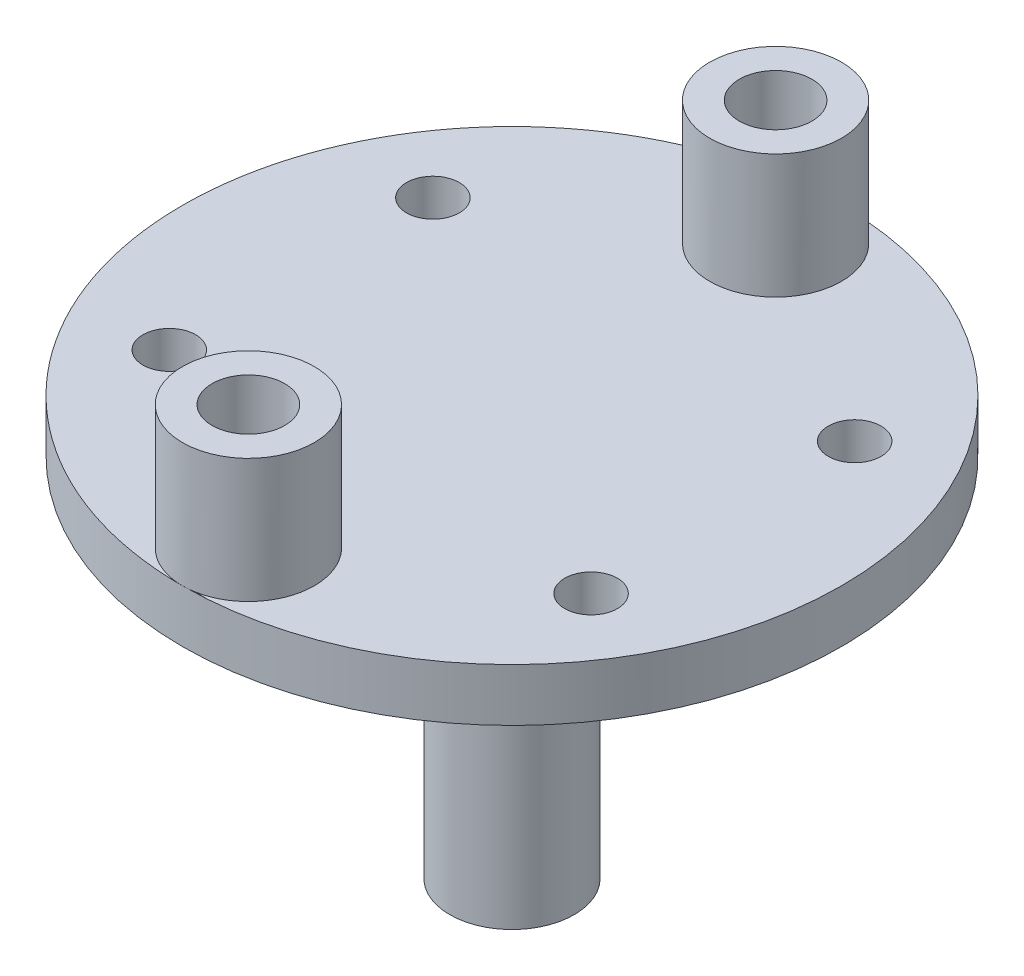
ISO-10303-21;
HEADER;
FILE_DESCRIPTION(('STEP AP214'),'2;1');
FILE_NAME('part.step','',(''),(''),'','','');
FILE_SCHEMA(('AUTOMOTIVE_DESIGN { 1 0 10303 214 1 1 1 1 }'));
ENDSEC;
DATA;
#1=APPLICATION_CONTEXT('core data for automotive mechanical design processes');
#2=APPLICATION_PROTOCOL_DEFINITION('international standard','automotive_design',2000,#1);
#3=PRODUCT_CONTEXT('',#1,'mechanical');
#4=PRODUCT('Part','Part','',(#3));
#5=PRODUCT_RELATED_PRODUCT_CATEGORY('part','',(#4));
#6=PRODUCT_DEFINITION_FORMATION('','',#4);
#7=PRODUCT_DEFINITION_CONTEXT('part definition',#1,'design');
#8=PRODUCT_DEFINITION('design','',#6,#7);
#9=PRODUCT_DEFINITION_SHAPE('','',#8);
#10=(LENGTH_UNIT() NAMED_UNIT(*) SI_UNIT(.MILLI.,.METRE.));
#11=(NAMED_UNIT(*) PLANE_ANGLE_UNIT() SI_UNIT($,.RADIAN.));
#12=(NAMED_UNIT(*) SI_UNIT($,.STERADIAN.) SOLID_ANGLE_UNIT());
#13=UNCERTAINTY_MEASURE_WITH_UNIT(LENGTH_MEASURE(1.E-05),#10,'distance_accuracy_value','');
#14=(GEOMETRIC_REPRESENTATION_CONTEXT(3) GLOBAL_UNCERTAINTY_ASSIGNED_CONTEXT((#13)) GLOBAL_UNIT_ASSIGNED_CONTEXT((#10,
#11,#12)) REPRESENTATION_CONTEXT('',''));
#15=CARTESIAN_POINT('',(0.,0.,0.));
#16=DIRECTION('',(0.,0.,1.));
#17=DIRECTION('',(1.,0.,0.));
#18=AXIS2_PLACEMENT_3D('',#15,#16,#17);
#19=CARTESIAN_POINT('',(12.7,2.54,-21.59));
#20=DIRECTION('',(0.,-1.,0.));
#21=DIRECTION('',(0.,0.,-1.));
#22=AXIS2_PLACEMENT_3D('',#19,#20,#21);
#23=CYLINDRICAL_SURFACE('',#22,1.75);
#24=CARTESIAN_POINT('',(12.7,0.,-21.59));
#25=DIRECTION('',(0.,1.,0.));
#26=DIRECTION('',(0.,0.,1.));
#27=AXIS2_PLACEMENT_3D('',#24,#25,#26);
#28=CIRCLE('',#27,1.75);
#29=CARTESIAN_POINT('',(12.7,0.,-19.84));
#30=VERTEX_POINT('',#29);
#31=EDGE_CURVE('E100',#30,#30,#28,.T.);
#32=ORIENTED_EDGE('',*,*,#31,.F.);
#33=EDGE_LOOP('',(#32));
#34=FACE_BOUND('',#33,.T.);
#35=CARTESIAN_POINT('',(12.7,8.514999988,-21.59));
#36=DIRECTION('',(0.,1.,0.));
#37=DIRECTION('',(0.,0.,1.));
#38=AXIS2_PLACEMENT_3D('',#35,#36,#37);
#39=CIRCLE('',#38,1.75);
#40=CARTESIAN_POINT('',(12.7,8.514999988,-19.84));
#41=VERTEX_POINT('',#40);
#42=EDGE_CURVE('E204',#41,#41,#39,.F.);
#43=ORIENTED_EDGE('',*,*,#42,.F.);
#44=EDGE_LOOP('',(#43));
#45=FACE_BOUND('',#44,.T.);
#46=ADVANCED_FACE('F50',(#34,#45),#23,.F.);
#47=CARTESIAN_POINT('',(12.7,2.54,-8.89));
#48=DIRECTION('',(0.,-1.,0.));
#49=DIRECTION('',(0.,0.,-1.));
#50=AXIS2_PLACEMENT_3D('',#47,#48,#49);
#51=CYLINDRICAL_SURFACE('',#50,15.875);
#52=CARTESIAN_POINT('',(12.7,2.54,-8.89));
#53=DIRECTION('',(0.,1.,0.));
#54=DIRECTION('',(0.,0.,1.));
#55=AXIS2_PLACEMENT_3D('',#52,#53,#54);
#56=CIRCLE('',#55,15.875);
#57=CARTESIAN_POINT('',(12.7,2.54,6.985));
#58=VERTEX_POINT('',#57);
#59=CARTESIAN_POINT('',(12.7,2.54,-24.765));
#60=VERTEX_POINT('',#59);
#61=EDGE_CURVE('E57',#58,#60,#56,.T.);
#62=ORIENTED_EDGE('',*,*,#61,.F.);
#63=EDGE_CURVE('E66',#60,#58,#56,.T.);
#64=ORIENTED_EDGE('',*,*,#63,.F.);
#65=EDGE_LOOP('',(#62,#64));
#66=FACE_BOUND('',#65,.T.);
#67=CARTESIAN_POINT('',(12.7,0.,-8.89));
#68=DIRECTION('',(0.,1.,0.));
#69=DIRECTION('',(0.,0.,1.));
#70=AXIS2_PLACEMENT_3D('',#67,#68,#69);
#71=CIRCLE('',#70,15.875);
#72=CARTESIAN_POINT('',(12.7,0.,6.985));
#73=VERTEX_POINT('',#72);
#74=EDGE_CURVE('E92',#73,#73,#71,.T.);
#75=ORIENTED_EDGE('',*,*,#74,.T.);
#76=EDGE_LOOP('',(#75));
#77=FACE_BOUND('',#76,.T.);
#78=ADVANCED_FACE('F69',(#66,#77),#51,.T.);
#79=CARTESIAN_POINT('',(2.54,2.54,-2.54));
#80=DIRECTION('',(0.,-1.,0.));
#81=DIRECTION('',(0.,0.,-1.));
#82=AXIS2_PLACEMENT_3D('',#79,#80,#81);
#83=CYLINDRICAL_SURFACE('',#82,1.27);
#84=CARTESIAN_POINT('',(2.54,2.54,-2.54));
#85=DIRECTION('',(0.,1.,0.));
#86=DIRECTION('',(0.,0.,1.));
#87=AXIS2_PLACEMENT_3D('',#84,#85,#86);
#88=CIRCLE('',#87,1.27);
#89=CARTESIAN_POINT('',(2.54,2.54,-1.27));
#90=VERTEX_POINT('',#89);
#91=EDGE_CURVE('E76',#90,#90,#88,.F.);
#92=ORIENTED_EDGE('',*,*,#91,.F.);
#93=EDGE_LOOP('',(#92));
#94=FACE_BOUND('',#93,.T.);
#95=CARTESIAN_POINT('',(2.54,0.,-2.54));
#96=DIRECTION('',(0.,1.,0.));
#97=DIRECTION('',(0.,0.,1.));
#98=AXIS2_PLACEMENT_3D('',#95,#96,#97);
#99=CIRCLE('',#98,1.27);
#100=CARTESIAN_POINT('',(2.54,0.,-1.27));
#101=VERTEX_POINT('',#100);
#102=EDGE_CURVE('E95',#101,#101,#99,.F.);
#103=ORIENTED_EDGE('',*,*,#102,.T.);
#104=EDGE_LOOP('',(#103));
#105=FACE_BOUND('',#104,.T.);
#106=ADVANCED_FACE('F130',(#94,#105),#83,.F.);
#107=CARTESIAN_POINT('',(22.86,2.54,-2.54));
#108=DIRECTION('',(0.,-1.,0.));
#109=DIRECTION('',(0.,0.,-1.));
#110=AXIS2_PLACEMENT_3D('',#107,#108,#109);
#111=CYLINDRICAL_SURFACE('',#110,1.27);
#112=CARTESIAN_POINT('',(22.86,2.54,-2.54));
#113=DIRECTION('',(0.,1.,0.));
#114=DIRECTION('',(0.,0.,1.));
#115=AXIS2_PLACEMENT_3D('',#112,#113,#114);
#116=CIRCLE('',#115,1.27);
#117=CARTESIAN_POINT('',(22.86,2.54,-1.27));
#118=VERTEX_POINT('',#117);
#119=EDGE_CURVE('E77',#118,#118,#116,.T.);
#120=ORIENTED_EDGE('',*,*,#119,.T.);
#121=EDGE_LOOP('',(#120));
#122=FACE_BOUND('',#121,.T.);
#123=CARTESIAN_POINT('',(22.86,0.,-2.54));
#124=DIRECTION('',(0.,1.,0.));
#125=DIRECTION('',(0.,0.,1.));
#126=AXIS2_PLACEMENT_3D('',#123,#124,#125);
#127=CIRCLE('',#126,1.27);
#128=CARTESIAN_POINT('',(22.86,0.,-1.27));
#129=VERTEX_POINT('',#128);
#130=EDGE_CURVE('E90',#129,#129,#127,.T.);
#131=ORIENTED_EDGE('',*,*,#130,.F.);
#132=EDGE_LOOP('',(#131));
#133=FACE_BOUND('',#132,.T.);
#134=ADVANCED_FACE('F120',(#122,#133),#111,.F.);
#135=CARTESIAN_POINT('',(2.54,2.54,-15.24));
#136=DIRECTION('',(0.,-1.,0.));
#137=DIRECTION('',(0.,0.,-1.));
#138=AXIS2_PLACEMENT_3D('',#135,#136,#137);
#139=CYLINDRICAL_SURFACE('',#138,1.27);
#140=CARTESIAN_POINT('',(2.54,2.54,-15.24));
#141=DIRECTION('',(0.,1.,0.));
#142=DIRECTION('',(0.,0.,1.));
#143=AXIS2_PLACEMENT_3D('',#140,#141,#142);
#144=CIRCLE('',#143,1.27);
#145=CARTESIAN_POINT('',(2.54,2.54,-13.97));
#146=VERTEX_POINT('',#145);
#147=EDGE_CURVE('E106',#146,#146,#144,.T.);
#148=ORIENTED_EDGE('',*,*,#147,.T.);
#149=EDGE_LOOP('',(#148));
#150=FACE_BOUND('',#149,.T.);
#151=CARTESIAN_POINT('',(2.54,0.,-15.24));
#152=DIRECTION('',(0.,1.,0.));
#153=DIRECTION('',(0.,0.,1.));
#154=AXIS2_PLACEMENT_3D('',#151,#152,#153);
#155=CIRCLE('',#154,1.27);
#156=CARTESIAN_POINT('',(2.54,0.,-13.97));
#157=VERTEX_POINT('',#156);
#158=EDGE_CURVE('E83',#157,#157,#155,.T.);
#159=ORIENTED_EDGE('',*,*,#158,.F.);
#160=EDGE_LOOP('',(#159));
#161=FACE_BOUND('',#160,.T.);
#162=ADVANCED_FACE('F151',(#150,#161),#139,.F.);
#163=CARTESIAN_POINT('',(22.86,2.54,-15.24));
#164=DIRECTION('',(0.,-1.,0.));
#165=DIRECTION('',(0.,0.,-1.));
#166=AXIS2_PLACEMENT_3D('',#163,#164,#165);
#167=CYLINDRICAL_SURFACE('',#166,1.27);
#168=CARTESIAN_POINT('',(22.86,2.54,-15.24));
#169=DIRECTION('',(0.,1.,0.));
#170=DIRECTION('',(0.,0.,1.));
#171=AXIS2_PLACEMENT_3D('',#168,#169,#170);
#172=CIRCLE('',#171,1.27);
#173=CARTESIAN_POINT('',(22.86,2.54,-13.97));
#174=VERTEX_POINT('',#173);
#175=EDGE_CURVE('E105',#174,#174,#172,.F.);
#176=ORIENTED_EDGE('',*,*,#175,.F.);
#177=EDGE_LOOP('',(#176));
#178=FACE_BOUND('',#177,.T.);
#179=CARTESIAN_POINT('',(22.86,0.,-15.24));
#180=DIRECTION('',(0.,1.,0.));
#181=DIRECTION('',(0.,0.,1.));
#182=AXIS2_PLACEMENT_3D('',#179,#180,#181);
#183=CIRCLE('',#182,1.27);
#184=CARTESIAN_POINT('',(22.86,0.,-13.97));
#185=VERTEX_POINT('',#184);
#186=EDGE_CURVE('E84',#185,#185,#183,.F.);
#187=ORIENTED_EDGE('',*,*,#186,.T.);
#188=EDGE_LOOP('',(#187));
#189=FACE_BOUND('',#188,.T.);
#190=ADVANCED_FACE('F47',(#178,#189),#167,.F.);
#191=CARTESIAN_POINT('',(12.7,2.54,3.81));
#192=DIRECTION('',(0.,-1.,0.));
#193=DIRECTION('',(0.,0.,-1.));
#194=AXIS2_PLACEMENT_3D('',#191,#192,#193);
#195=CYLINDRICAL_SURFACE('',#194,1.75);
#196=CARTESIAN_POINT('',(12.7,0.,3.81));
#197=DIRECTION('',(0.,1.,0.));
#198=DIRECTION('',(0.,0.,1.));
#199=AXIS2_PLACEMENT_3D('',#196,#197,#198);
#200=CIRCLE('',#199,1.75);
#201=CARTESIAN_POINT('',(12.7,0.,5.56));
#202=VERTEX_POINT('',#201);
#203=EDGE_CURVE('E51',#202,#202,#200,.F.);
#204=ORIENTED_EDGE('',*,*,#203,.T.);
#205=EDGE_LOOP('',(#204));
#206=FACE_BOUND('',#205,.T.);
#207=CARTESIAN_POINT('',(12.7,8.514999988,3.81));
#208=DIRECTION('',(0.,1.,0.));
#209=DIRECTION('',(0.,0.,1.));
#210=AXIS2_PLACEMENT_3D('',#207,#208,#209);
#211=CIRCLE('',#210,1.75);
#212=CARTESIAN_POINT('',(12.7,8.514999988,5.56));
#213=VERTEX_POINT('',#212);
#214=EDGE_CURVE('E205',#213,#213,#211,.F.);
#215=ORIENTED_EDGE('',*,*,#214,.F.);
#216=EDGE_LOOP('',(#215));
#217=FACE_BOUND('',#216,.T.);
#218=ADVANCED_FACE('F125',(#206,#217),#195,.F.);
#219=CARTESIAN_POINT('',(0.,2.54,0.));
#220=DIRECTION('',(0.,1.,0.));
#221=DIRECTION('',(0.,0.,1.));
#222=AXIS2_PLACEMENT_3D('',#219,#220,#221);
#223=PLANE('',#222);
#224=ORIENTED_EDGE('',*,*,#175,.T.);
#225=EDGE_LOOP('',(#224));
#226=FACE_BOUND('',#225,.T.);
#227=ORIENTED_EDGE('',*,*,#147,.F.);
#228=EDGE_LOOP('',(#227));
#229=FACE_BOUND('',#228,.T.);
#230=ORIENTED_EDGE('',*,*,#119,.F.);
#231=EDGE_LOOP('',(#230));
#232=FACE_BOUND('',#231,.T.);
#233=ORIENTED_EDGE('',*,*,#91,.T.);
#234=EDGE_LOOP('',(#233));
#235=FACE_BOUND('',#234,.T.);
#236=ORIENTED_EDGE('',*,*,#61,.T.);
#237=CARTESIAN_POINT('',(12.7,2.54,-21.59));
#238=DIRECTION('',(0.,1.,0.));
#239=DIRECTION('',(0.,0.,1.));
#240=AXIS2_PLACEMENT_3D('',#237,#238,#239);
#241=CIRCLE('',#240,3.175);
#242=EDGE_CURVE('E73',#60,#60,#241,.T.);
#243=ORIENTED_EDGE('',*,*,#242,.F.);
#244=ORIENTED_EDGE('',*,*,#63,.T.);
#245=CARTESIAN_POINT('',(12.7,2.54,3.81));
#246=DIRECTION('',(0.,1.,0.));
#247=DIRECTION('',(0.,0.,1.));
#248=AXIS2_PLACEMENT_3D('',#245,#246,#247);
#249=CIRCLE('',#248,3.175);
#250=EDGE_CURVE('E71',#58,#58,#249,.T.);
#251=ORIENTED_EDGE('',*,*,#250,.F.);
#252=EDGE_LOOP('',(#236,#243,#244,#251));
#253=FACE_BOUND('',#252,.T.);
#254=ADVANCED_FACE('F72',(#226,#229,#232,#235,#253),#223,.T.);
#255=CARTESIAN_POINT('',(0.,0.,0.));
#256=DIRECTION('',(0.,1.,0.));
#257=DIRECTION('',(0.,0.,1.));
#258=AXIS2_PLACEMENT_3D('',#255,#256,#257);
#259=PLANE('',#258);
#260=CARTESIAN_POINT('',(12.7,0.,-8.89000000000006));
#261=DIRECTION('',(0.,-1.,0.));
#262=DIRECTION('',(0.,0.,-1.));
#263=AXIS2_PLACEMENT_3D('',#260,#261,#262);
#264=CIRCLE('',#263,3.);
#265=CARTESIAN_POINT('',(12.7,0.,-5.89000000000006));
#266=VERTEX_POINT('',#265);
#267=EDGE_CURVE('E11',#266,#266,#264,.T.);
#268=ORIENTED_EDGE('',*,*,#267,.F.);
#269=EDGE_LOOP('',(#268));
#270=FACE_BOUND('',#269,.T.);
#271=ORIENTED_EDGE('',*,*,#186,.F.);
#272=EDGE_LOOP('',(#271));
#273=FACE_BOUND('',#272,.T.);
#274=ORIENTED_EDGE('',*,*,#158,.T.);
#275=EDGE_LOOP('',(#274));
#276=FACE_BOUND('',#275,.T.);
#277=ORIENTED_EDGE('',*,*,#130,.T.);
#278=EDGE_LOOP('',(#277));
#279=FACE_BOUND('',#278,.T.);
#280=ORIENTED_EDGE('',*,*,#102,.F.);
#281=EDGE_LOOP('',(#280));
#282=FACE_BOUND('',#281,.T.);
#283=ORIENTED_EDGE('',*,*,#74,.F.);
#284=EDGE_LOOP('',(#283));
#285=FACE_BOUND('',#284,.T.);
#286=ORIENTED_EDGE('',*,*,#31,.T.);
#287=EDGE_LOOP('',(#286));
#288=FACE_BOUND('',#287,.T.);
#289=ORIENTED_EDGE('',*,*,#203,.F.);
#290=EDGE_LOOP('',(#289));
#291=FACE_BOUND('',#290,.T.);
#292=ADVANCED_FACE('F124',(#270,#273,#276,#279,#282,#285,#288,#291),#259,.F.);
#293=CARTESIAN_POINT('',(12.7,8.514999988,3.81));
#294=DIRECTION('',(0.,-1.,0.));
#295=DIRECTION('',(0.,0.,-1.));
#296=AXIS2_PLACEMENT_3D('',#293,#294,#295);
#297=CYLINDRICAL_SURFACE('',#296,3.175);
#298=CARTESIAN_POINT('',(12.7,8.514999988,3.81));
#299=DIRECTION('',(0.,1.,0.));
#300=DIRECTION('',(0.,0.,1.));
#301=AXIS2_PLACEMENT_3D('',#298,#299,#300);
#302=CIRCLE('',#301,3.175);
#303=CARTESIAN_POINT('',(12.7,8.514999988,6.985));
#304=VERTEX_POINT('',#303);
#305=EDGE_CURVE('E209',#304,#304,#302,.T.);
#306=ORIENTED_EDGE('',*,*,#305,.F.);
#307=EDGE_LOOP('',(#306));
#308=FACE_BOUND('',#307,.T.);
#309=ORIENTED_EDGE('',*,*,#250,.T.);
#310=EDGE_LOOP('',(#309));
#311=FACE_BOUND('',#310,.T.);
#312=ADVANCED_FACE('F134',(#308,#311),#297,.T.);
#313=CARTESIAN_POINT('',(0.,8.514999988,0.));
#314=DIRECTION('',(0.,1.,0.));
#315=DIRECTION('',(0.,0.,1.));
#316=AXIS2_PLACEMENT_3D('',#313,#314,#315);
#317=PLANE('',#316);
#318=ORIENTED_EDGE('',*,*,#214,.T.);
#319=EDGE_LOOP('',(#318));
#320=FACE_BOUND('',#319,.T.);
#321=ORIENTED_EDGE('',*,*,#305,.T.);
#322=EDGE_LOOP('',(#321));
#323=FACE_BOUND('',#322,.T.);
#324=ADVANCED_FACE('F177',(#320,#323),#317,.T.);
#325=CARTESIAN_POINT('',(12.7,8.514999988,-21.59));
#326=DIRECTION('',(0.,-1.,0.));
#327=DIRECTION('',(0.,0.,-1.));
#328=AXIS2_PLACEMENT_3D('',#325,#326,#327);
#329=CYLINDRICAL_SURFACE('',#328,3.175);
#330=CARTESIAN_POINT('',(12.7,8.514999988,-21.59));
#331=DIRECTION('',(0.,1.,0.));
#332=DIRECTION('',(0.,0.,1.));
#333=AXIS2_PLACEMENT_3D('',#330,#331,#332);
#334=CIRCLE('',#333,3.175);
#335=CARTESIAN_POINT('',(12.7,8.514999988,-18.415));
#336=VERTEX_POINT('',#335);
#337=EDGE_CURVE('E88',#336,#336,#334,.T.);
#338=ORIENTED_EDGE('',*,*,#337,.F.);
#339=EDGE_LOOP('',(#338));
#340=FACE_BOUND('',#339,.T.);
#341=ORIENTED_EDGE('',*,*,#242,.T.);
#342=EDGE_LOOP('',(#341));
#343=FACE_BOUND('',#342,.T.);
#344=ADVANCED_FACE('F178',(#340,#343),#329,.T.);
#345=CARTESIAN_POINT('',(0.,8.514999988,0.));
#346=DIRECTION('',(0.,1.,0.));
#347=DIRECTION('',(0.,0.,1.));
#348=AXIS2_PLACEMENT_3D('',#345,#346,#347);
#349=PLANE('',#348);
#350=ORIENTED_EDGE('',*,*,#42,.T.);
#351=EDGE_LOOP('',(#350));
#352=FACE_BOUND('',#351,.T.);
#353=ORIENTED_EDGE('',*,*,#337,.T.);
#354=EDGE_LOOP('',(#353));
#355=FACE_BOUND('',#354,.T.);
#356=ADVANCED_FACE('F184',(#352,#355),#349,.T.);
#357=CARTESIAN_POINT('',(12.7,-17.61998,-8.89000000000006));
#358=DIRECTION('',(0.,1.,0.));
#359=DIRECTION('',(0.,0.,1.));
#360=AXIS2_PLACEMENT_3D('',#357,#358,#359);
#361=CYLINDRICAL_SURFACE('',#360,3.);
#362=CARTESIAN_POINT('',(12.7,-17.61998,-8.89000000000006));
#363=DIRECTION('',(0.,-1.,0.));
#364=DIRECTION('',(0.,0.,-1.));
#365=AXIS2_PLACEMENT_3D('',#362,#363,#364);
#366=CIRCLE('',#365,3.);
#367=CARTESIAN_POINT('',(12.7,-17.61998,-5.89000000000006));
#368=VERTEX_POINT('',#367);
#369=EDGE_CURVE('E199',#368,#368,#366,.T.);
#370=CARTESIAN_POINT('',(12.7,-17.61998,-5.89000000000006));
#371=CARTESIAN_POINT('',(12.7,-17.4364385416667,-5.89000000000006));
#372=CARTESIAN_POINT('',(12.7,-17.2528970833333,-5.89000000000006));
#373=CARTESIAN_POINT('',(12.7,-16.8858141666667,-5.89000000000006));
#374=CARTESIAN_POINT('',(12.7,-16.7022727083333,-5.89000000000006));
#375=CARTESIAN_POINT('',(12.7,-16.3351897916667,-5.89000000000006));
#376=CARTESIAN_POINT('',(12.7,-16.1516483333333,-5.89000000000006));
#377=CARTESIAN_POINT('',(12.7,-15.7845654166667,-5.89000000000006));
#378=CARTESIAN_POINT('',(12.7,-15.6010239583333,-5.89000000000006));
#379=CARTESIAN_POINT('',(12.7,-15.2339410416667,-5.89000000000006));
#380=CARTESIAN_POINT('',(12.7,-15.0503995833333,-5.89000000000006));
#381=CARTESIAN_POINT('',(12.7,-14.6833166666667,-5.89000000000006));
#382=CARTESIAN_POINT('',(12.7,-14.4997752083333,-5.89000000000006));
#383=CARTESIAN_POINT('',(12.7,-14.1326922916667,-5.89000000000006));
#384=CARTESIAN_POINT('',(12.7,-13.9491508333333,-5.89000000000006));
#385=CARTESIAN_POINT('',(12.7,-13.5820679166667,-5.89000000000006));
#386=CARTESIAN_POINT('',(12.7,-13.3985264583333,-5.89000000000006));
#387=CARTESIAN_POINT('',(12.7,-13.0314435416667,-5.89000000000006));
#388=CARTESIAN_POINT('',(12.7,-12.8479020833333,-5.89000000000006));
#389=CARTESIAN_POINT('',(12.7,-12.4808191666667,-5.89000000000006));
#390=CARTESIAN_POINT('',(12.7,-12.2972777083333,-5.89000000000006));
#391=CARTESIAN_POINT('',(12.7,-11.9301947916667,-5.89000000000006));
#392=CARTESIAN_POINT('',(12.7,-11.7466533333333,-5.89000000000006));
#393=CARTESIAN_POINT('',(12.7,-11.3795704166667,-5.89000000000006));
#394=CARTESIAN_POINT('',(12.7,-11.1960289583333,-5.89000000000006));
#395=CARTESIAN_POINT('',(12.7,-10.8289460416667,-5.89000000000006));
#396=CARTESIAN_POINT('',(12.7,-10.6454045833333,-5.89000000000006));
#397=CARTESIAN_POINT('',(12.7,-10.2783216666667,-5.89000000000006));
#398=CARTESIAN_POINT('',(12.7,-10.0947802083333,-5.89000000000006));
#399=CARTESIAN_POINT('',(12.7,-9.72769729166667,-5.89000000000006));
#400=CARTESIAN_POINT('',(12.7,-9.54415583333333,-5.89000000000006));
#401=CARTESIAN_POINT('',(12.7,-9.17707291666666,-5.89000000000006));
#402=CARTESIAN_POINT('',(12.7,-8.99353145833333,-5.89000000000006));
#403=CARTESIAN_POINT('',(12.7,-8.62644854166667,-5.89000000000006));
#404=CARTESIAN_POINT('',(12.7,-8.44290708333333,-5.89000000000006));
#405=CARTESIAN_POINT('',(12.7,-8.07582416666667,-5.89000000000006));
#406=CARTESIAN_POINT('',(12.7,-7.89228270833333,-5.89000000000006));
#407=CARTESIAN_POINT('',(12.7,-7.52519979166667,-5.89000000000006));
#408=CARTESIAN_POINT('',(12.7,-7.34165833333333,-5.89000000000006));
#409=CARTESIAN_POINT('',(12.7,-6.97457541666667,-5.89000000000006));
#410=CARTESIAN_POINT('',(12.7,-6.79103395833333,-5.89000000000006));
#411=CARTESIAN_POINT('',(12.7,-6.42395104166666,-5.89000000000006));
#412=CARTESIAN_POINT('',(12.7,-6.24040958333333,-5.89000000000006));
#413=CARTESIAN_POINT('',(12.7,-5.87332666666666,-5.89000000000006));
#414=CARTESIAN_POINT('',(12.7,-5.68978520833333,-5.89000000000006));
#415=CARTESIAN_POINT('',(12.7,-5.32270229166666,-5.89000000000006));
#416=CARTESIAN_POINT('',(12.7,-5.13916083333333,-5.89000000000006));
#417=CARTESIAN_POINT('',(12.7,-4.77207791666666,-5.89000000000006));
#418=CARTESIAN_POINT('',(12.7,-4.58853645833333,-5.89000000000006));
#419=CARTESIAN_POINT('',(12.7,-4.22145354166666,-5.89000000000006));
#420=CARTESIAN_POINT('',(12.7,-4.03791208333333,-5.89000000000006));
#421=CARTESIAN_POINT('',(12.7,-3.67082916666666,-5.89000000000006));
#422=CARTESIAN_POINT('',(12.7,-3.48728770833333,-5.89000000000006));
#423=CARTESIAN_POINT('',(12.7,-3.12020479166666,-5.89000000000006));
#424=CARTESIAN_POINT('',(12.7,-2.93666333333333,-5.89000000000006));
#425=CARTESIAN_POINT('',(12.7,-2.56958041666666,-5.89000000000006));
#426=CARTESIAN_POINT('',(12.7,-2.38603895833333,-5.89000000000006));
#427=CARTESIAN_POINT('',(12.7,-2.01895604166666,-5.89000000000006));
#428=CARTESIAN_POINT('',(12.7,-1.83541458333333,-5.89000000000006));
#429=CARTESIAN_POINT('',(12.7,-1.46833166666666,-5.89000000000006));
#430=CARTESIAN_POINT('',(12.7,-1.28479020833333,-5.89000000000006));
#431=CARTESIAN_POINT('',(12.7,-0.917707291666662,-5.89000000000006));
#432=CARTESIAN_POINT('',(12.7,-0.734165833333329,-5.89000000000006));
#433=CARTESIAN_POINT('',(12.7,-0.367082916666663,-5.89000000000006));
#434=CARTESIAN_POINT('',(12.7,-0.183541458333329,-5.89000000000006));
#435=CARTESIAN_POINT('',(12.7,0.,-5.89000000000006));
#436=B_SPLINE_CURVE_WITH_KNOTS('',3,(#370,#371,#372,#373,#374,#375,#376,#377,#378,#379,#380,
#381,#382,#383,#384,#385,#386,#387,#388,#389,#390,#391,#392,#393,#394,#395,#396,#397,#398,#399,
#400,#401,#402,#403,#404,#405,#406,#407,#408,#409,#410,#411,#412,#413,#414,#415,#416,#417,#418,
#419,#420,#421,#422,#423,#424,#425,#426,#427,#428,#429,#430,#431,#432,#433,#434,#435),
.UNSPECIFIED.,.F.,.F.,(4,2,2,2,2,2,2,2,2,2,2,2,2,2,2,2,2,2,2,2,2,2,2,2,2,2,2,2,2,2,2,2,4),(0.,
0.550624374999999,1.10124875,1.651873125,2.2024975,2.753121875,3.30374625,3.854370625,4.404995,
4.955619375,5.50624375,6.056868125,6.6074925,7.158116875,7.70874125,8.259365625,8.80999,
9.360614375,9.91123875,10.461863125,11.0124875,11.563111875,12.11373625,12.664360625,13.214985,
13.765609375,14.31623375,14.866858125,15.4174825,15.968106875,16.51873125,17.069355625,
17.61998),.UNSPECIFIED.);
#437=EDGE_CURVE('BSEAM187',#368,#266,#436,.T.);
#438=ORIENTED_EDGE('',*,*,#369,.F.);
#439=ORIENTED_EDGE('',*,*,#267,.T.);
#440=ORIENTED_EDGE('',*,*,#437,.T.);
#441=ORIENTED_EDGE('',*,*,#437,.F.);
#442=EDGE_LOOP('',(#438,#440,#439,#441));
#443=FACE_BOUND('',#442,.T.);
#444=ADVANCED_FACE('F187',(#443),#361,.T.);
#445=CARTESIAN_POINT('',(0.,-17.61998,0.));
#446=DIRECTION('',(0.,-1.,0.));
#447=DIRECTION('',(0.,0.,-1.));
#448=AXIS2_PLACEMENT_3D('',#445,#446,#447);
#449=PLANE('',#448);
#450=ORIENTED_EDGE('',*,*,#369,.T.);
#451=EDGE_LOOP('',(#450));
#452=FACE_BOUND('',#451,.T.);
#453=ADVANCED_FACE('F194',(#452),#449,.T.);
#454=CLOSED_SHELL('',(#46,#78,#106,#134,#162,#190,#218,#254,#292,#312,#324,#344,#356,#444,#453));
#455=MANIFOLD_SOLID_BREP('B2',#454);
#456=ADVANCED_BREP_SHAPE_REPRESENTATION('',(#18,#455),#14);
#457=SHAPE_DEFINITION_REPRESENTATION(#9,#456);
ENDSEC;
END-ISO-10303-21;
